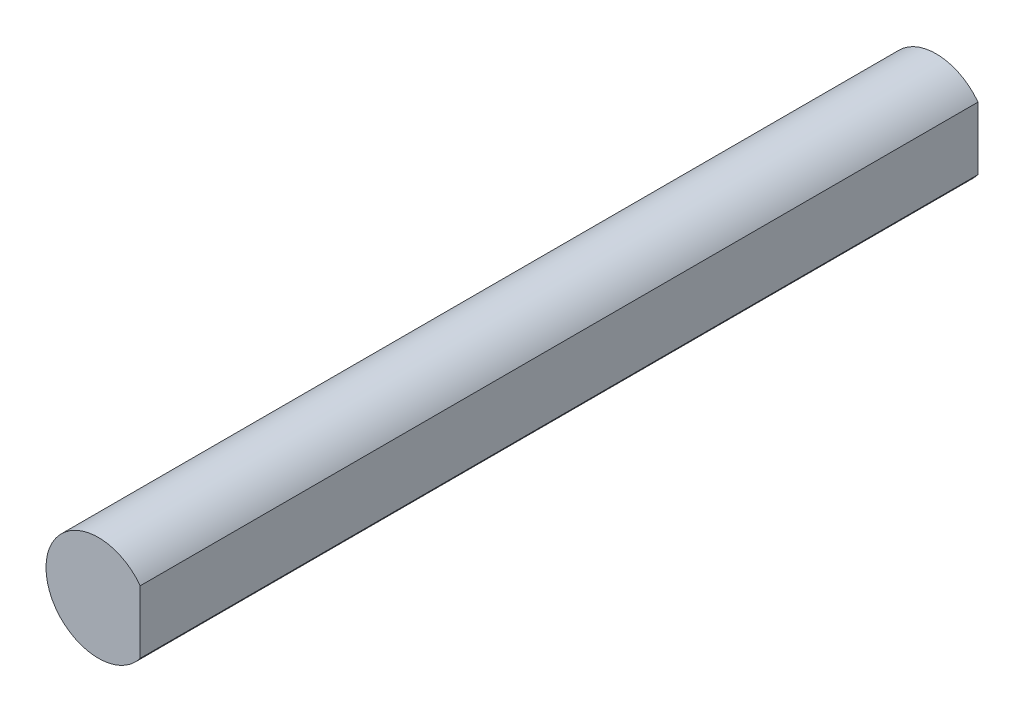
ISO-10303-21;
HEADER;
FILE_DESCRIPTION(('STEP AP214'),'2;1');
FILE_NAME('part.step','',(''),(''),'','','');
FILE_SCHEMA(('AUTOMOTIVE_DESIGN { 1 0 10303 214 1 1 1 1 }'));
ENDSEC;
DATA;
#1=APPLICATION_CONTEXT('core data for automotive mechanical design processes');
#2=APPLICATION_PROTOCOL_DEFINITION('international standard','automotive_design',2000,#1);
#3=PRODUCT_CONTEXT('',#1,'mechanical');
#4=PRODUCT('Part','Part','',(#3));
#5=PRODUCT_RELATED_PRODUCT_CATEGORY('part','',(#4));
#6=PRODUCT_DEFINITION_FORMATION('','',#4);
#7=PRODUCT_DEFINITION_CONTEXT('part definition',#1,'design');
#8=PRODUCT_DEFINITION('design','',#6,#7);
#9=PRODUCT_DEFINITION_SHAPE('','',#8);
#10=(LENGTH_UNIT() NAMED_UNIT(*) SI_UNIT(.MILLI.,.METRE.));
#11=(NAMED_UNIT(*) PLANE_ANGLE_UNIT() SI_UNIT($,.RADIAN.));
#12=(NAMED_UNIT(*) SI_UNIT($,.STERADIAN.) SOLID_ANGLE_UNIT());
#13=UNCERTAINTY_MEASURE_WITH_UNIT(LENGTH_MEASURE(1.E-05),#10,'distance_accuracy_value','');
#14=(GEOMETRIC_REPRESENTATION_CONTEXT(3) GLOBAL_UNCERTAINTY_ASSIGNED_CONTEXT((#13)) GLOBAL_UNIT_ASSIGNED_CONTEXT((#10,
#11,#12)) REPRESENTATION_CONTEXT('',''));
#15=CARTESIAN_POINT('',(0.,0.,0.));
#16=DIRECTION('',(0.,0.,1.));
#17=DIRECTION('',(1.,0.,0.));
#18=AXIS2_PLACEMENT_3D('',#15,#16,#17);
#19=CARTESIAN_POINT('',(0.,0.,50.8));
#20=DIRECTION('',(0.,0.,-1.));
#21=DIRECTION('',(-1.,0.,0.));
#22=AXIS2_PLACEMENT_3D('',#19,#20,#21);
#23=CYLINDRICAL_SURFACE('',#22,3.175);
#24=CARTESIAN_POINT('',(0.,0.,50.8));
#25=DIRECTION('',(0.,0.,1.));
#26=DIRECTION('',(1.,0.,0.));
#27=AXIS2_PLACEMENT_3D('',#24,#25,#26);
#28=CIRCLE('',#27,3.175);
#29=CARTESIAN_POINT('',(2.54,1.905,50.8));
#30=VERTEX_POINT('',#29);
#31=CARTESIAN_POINT('',(2.54,-1.905,50.8));
#32=VERTEX_POINT('',#31);
#33=EDGE_CURVE('E12',#30,#32,#28,.T.);
#34=ORIENTED_EDGE('',*,*,#33,.F.);
#35=DIRECTION('',(0.,0.,-1.));
#36=VECTOR('',#35,1.);
#37=CARTESIAN_POINT('',(2.54,1.905,50.8));
#38=LINE('',#37,#36);
#39=CARTESIAN_POINT('',(2.54,1.905,0.));
#40=VERTEX_POINT('',#39);
#41=EDGE_CURVE('E77',#40,#30,#38,.F.);
#42=ORIENTED_EDGE('',*,*,#41,.F.);
#43=CARTESIAN_POINT('',(0.,0.,0.));
#44=DIRECTION('',(0.,0.,1.));
#45=DIRECTION('',(1.,0.,0.));
#46=AXIS2_PLACEMENT_3D('',#43,#44,#45);
#47=CIRCLE('',#46,3.175);
#48=CARTESIAN_POINT('',(2.54,-1.905,0.));
#49=VERTEX_POINT('',#48);
#50=EDGE_CURVE('E51',#40,#49,#47,.T.);
#51=ORIENTED_EDGE('',*,*,#50,.T.);
#52=DIRECTION('',(0.,0.,-1.));
#53=VECTOR('',#52,1.);
#54=CARTESIAN_POINT('',(2.54,-1.905,50.8));
#55=LINE('',#54,#53);
#56=EDGE_CURVE('E66',#32,#49,#55,.T.);
#57=ORIENTED_EDGE('',*,*,#56,.F.);
#58=EDGE_LOOP('',(#34,#42,#51,#57));
#59=FACE_BOUND('',#58,.T.);
#60=ADVANCED_FACE('F47',(#59),#23,.T.);
#61=CARTESIAN_POINT('',(0.,0.,50.8));
#62=DIRECTION('',(0.,0.,1.));
#63=DIRECTION('',(1.,0.,0.));
#64=AXIS2_PLACEMENT_3D('',#61,#62,#63);
#65=PLANE('',#64);
#66=DIRECTION('',(0.,1.,0.));
#67=VECTOR('',#66,1.);
#68=CARTESIAN_POINT('',(2.54,3.14969186852136,50.8));
#69=LINE('',#68,#67);
#70=EDGE_CURVE('E80',#32,#30,#69,.T.);
#71=ORIENTED_EDGE('',*,*,#70,.T.);
#72=ORIENTED_EDGE('',*,*,#33,.T.);
#73=EDGE_LOOP('',(#71,#72));
#74=FACE_BOUND('',#73,.T.);
#75=ADVANCED_FACE('F88',(#74),#65,.T.);
#76=CARTESIAN_POINT('',(0.,0.,0.));
#77=DIRECTION('',(0.,0.,1.));
#78=DIRECTION('',(1.,0.,0.));
#79=AXIS2_PLACEMENT_3D('',#76,#77,#78);
#80=PLANE('',#79);
#81=ORIENTED_EDGE('',*,*,#50,.F.);
#82=DIRECTION('',(0.,1.,0.));
#83=VECTOR('',#82,1.);
#84=CARTESIAN_POINT('',(2.54,3.14969186852136,0.));
#85=LINE('',#84,#83);
#86=EDGE_CURVE('E71',#49,#40,#85,.T.);
#87=ORIENTED_EDGE('',*,*,#86,.F.);
#88=EDGE_LOOP('',(#81,#87));
#89=FACE_BOUND('',#88,.T.);
#90=ADVANCED_FACE('F103',(#89),#80,.F.);
#91=CARTESIAN_POINT('',(2.54,3.14969186852136,50.801));
#92=DIRECTION('',(-1.,0.,0.));
#93=DIRECTION('',(0.,-1.,0.));
#94=AXIS2_PLACEMENT_3D('',#91,#92,#93);
#95=PLANE('',#94);
#96=ORIENTED_EDGE('',*,*,#41,.T.);
#97=ORIENTED_EDGE('',*,*,#70,.F.);
#98=ORIENTED_EDGE('',*,*,#56,.T.);
#99=ORIENTED_EDGE('',*,*,#86,.T.);
#100=EDGE_LOOP('',(#96,#97,#98,#99));
#101=FACE_BOUND('',#100,.T.);
#102=ADVANCED_FACE('F79',(#101),#95,.F.);
#103=CLOSED_SHELL('',(#60,#75,#90,#102));
#104=MANIFOLD_SOLID_BREP('B2',#103);
#105=ADVANCED_BREP_SHAPE_REPRESENTATION('',(#18,#104),#14);
#106=SHAPE_DEFINITION_REPRESENTATION(#9,#105);
ENDSEC;
END-ISO-10303-21;
